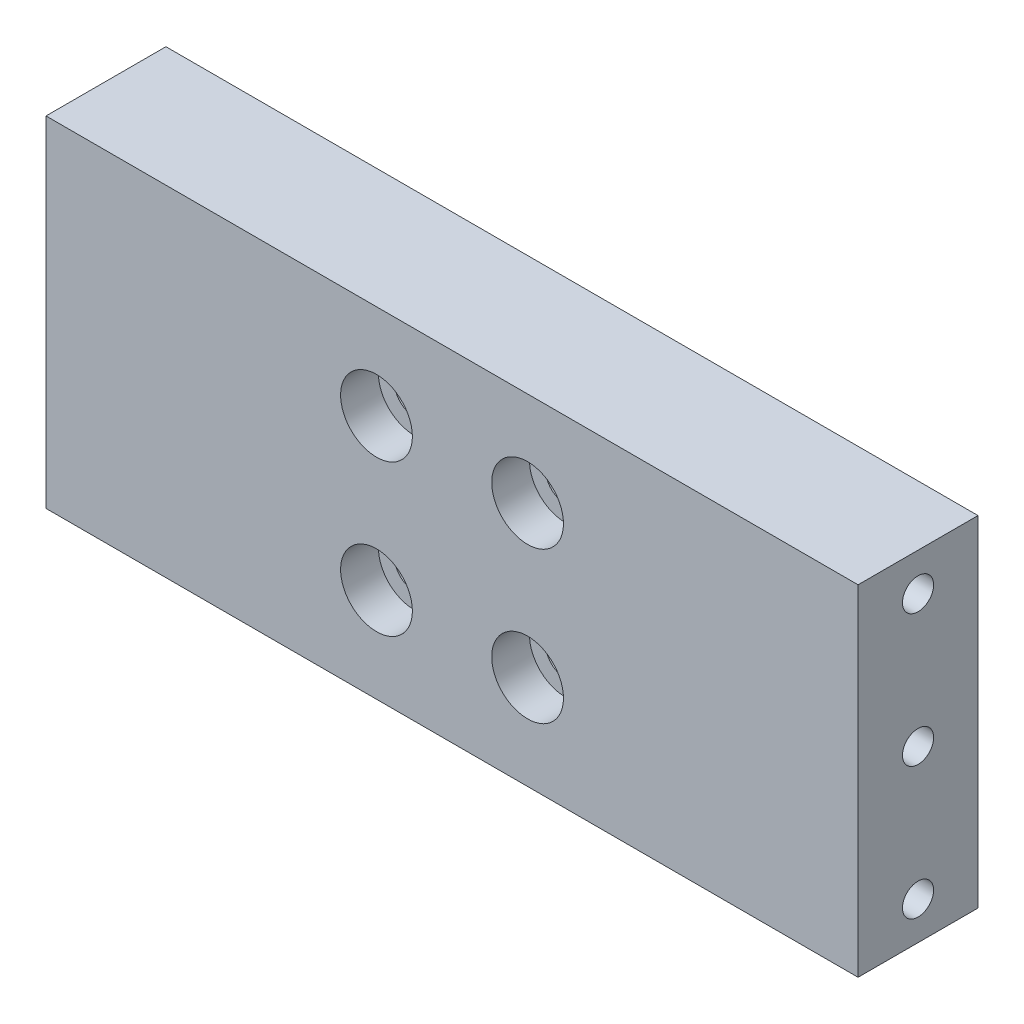
ISO-10303-21;
HEADER;
FILE_DESCRIPTION(('STEP AP214'),'2;1');
FILE_NAME('part.step','',(''),(''),'','','');
FILE_SCHEMA(('AUTOMOTIVE_DESIGN { 1 0 10303 214 1 1 1 1 }'));
ENDSEC;
DATA;
#1=APPLICATION_CONTEXT('core data for automotive mechanical design processes');
#2=APPLICATION_PROTOCOL_DEFINITION('international standard','automotive_design',2000,#1);
#3=PRODUCT_CONTEXT('',#1,'mechanical');
#4=PRODUCT('Part','Part','',(#3));
#5=PRODUCT_RELATED_PRODUCT_CATEGORY('part','',(#4));
#6=PRODUCT_DEFINITION_FORMATION('','',#4);
#7=PRODUCT_DEFINITION_CONTEXT('part definition',#1,'design');
#8=PRODUCT_DEFINITION('design','',#6,#7);
#9=PRODUCT_DEFINITION_SHAPE('','',#8);
#10=(LENGTH_UNIT() NAMED_UNIT(*) SI_UNIT(.MILLI.,.METRE.));
#11=(NAMED_UNIT(*) PLANE_ANGLE_UNIT() SI_UNIT($,.RADIAN.));
#12=(NAMED_UNIT(*) SI_UNIT($,.STERADIAN.) SOLID_ANGLE_UNIT());
#13=UNCERTAINTY_MEASURE_WITH_UNIT(LENGTH_MEASURE(1.E-05),#10,'distance_accuracy_value','');
#14=(GEOMETRIC_REPRESENTATION_CONTEXT(3) GLOBAL_UNCERTAINTY_ASSIGNED_CONTEXT((#13)) GLOBAL_UNIT_ASSIGNED_CONTEXT((#10,
#11,#12)) REPRESENTATION_CONTEXT('',''));
#15=CARTESIAN_POINT('',(0.,0.,0.));
#16=DIRECTION('',(0.,0.,1.));
#17=DIRECTION('',(1.,0.,0.));
#18=AXIS2_PLACEMENT_3D('',#15,#16,#17);
#19=CARTESIAN_POINT('',(-43.,-18.,6.35));
#20=DIRECTION('',(1.,0.,0.));
#21=DIRECTION('',(0.,1.,0.));
#22=AXIS2_PLACEMENT_3D('',#19,#20,#21);
#23=PLANE('',#22);
#24=CARTESIAN_POINT('',(-43.,14.,0.));
#25=DIRECTION('',(-1.,0.,0.));
#26=DIRECTION('',(0.,-1.,0.));
#27=AXIS2_PLACEMENT_3D('',#24,#25,#26);
#28=CIRCLE('',#27,1.65);
#29=CARTESIAN_POINT('',(-43.,12.35,0.));
#30=VERTEX_POINT('',#29);
#31=EDGE_CURVE('E180',#30,#30,#28,.T.);
#32=ORIENTED_EDGE('',*,*,#31,.F.);
#33=EDGE_LOOP('',(#32));
#34=FACE_BOUND('',#33,.T.);
#35=CARTESIAN_POINT('',(-43.,-14.,0.));
#36=DIRECTION('',(-1.,0.,0.));
#37=DIRECTION('',(0.,-1.,0.));
#38=AXIS2_PLACEMENT_3D('',#35,#36,#37);
#39=CIRCLE('',#38,1.65);
#40=CARTESIAN_POINT('',(-43.,-15.65,0.));
#41=VERTEX_POINT('',#40);
#42=EDGE_CURVE('E173',#41,#41,#39,.T.);
#43=ORIENTED_EDGE('',*,*,#42,.F.);
#44=EDGE_LOOP('',(#43));
#45=FACE_BOUND('',#44,.T.);
#46=CARTESIAN_POINT('',(-43.,0.,0.));
#47=DIRECTION('',(-1.,0.,0.));
#48=DIRECTION('',(0.,-1.,0.));
#49=AXIS2_PLACEMENT_3D('',#46,#47,#48);
#50=CIRCLE('',#49,1.65);
#51=CARTESIAN_POINT('',(-43.,-1.64999999999998,0.));
#52=VERTEX_POINT('',#51);
#53=EDGE_CURVE('E170',#52,#52,#50,.T.);
#54=ORIENTED_EDGE('',*,*,#53,.F.);
#55=EDGE_LOOP('',(#54));
#56=FACE_BOUND('',#55,.T.);
#57=DIRECTION('',(0.,-1.,0.));
#58=VECTOR('',#57,1.);
#59=CARTESIAN_POINT('',(-43.,-18.,-6.35));
#60=LINE('',#59,#58);
#61=CARTESIAN_POINT('',(-43.,18.,-6.35));
#62=VERTEX_POINT('',#61);
#63=CARTESIAN_POINT('',(-43.,-18.,-6.35));
#64=VERTEX_POINT('',#63);
#65=EDGE_CURVE('E105',#62,#64,#60,.T.);
#66=ORIENTED_EDGE('',*,*,#65,.T.);
#67=DIRECTION('',(0.,0.,-1.));
#68=VECTOR('',#67,1.);
#69=CARTESIAN_POINT('',(-43.,-18.,6.35));
#70=LINE('',#69,#68);
#71=CARTESIAN_POINT('',(-43.,-18.,6.35));
#72=VERTEX_POINT('',#71);
#73=EDGE_CURVE('E11',#72,#64,#70,.T.);
#74=ORIENTED_EDGE('',*,*,#73,.F.);
#75=DIRECTION('',(0.,-1.,0.));
#76=VECTOR('',#75,1.);
#77=CARTESIAN_POINT('',(-43.,-18.,6.35));
#78=LINE('',#77,#76);
#79=CARTESIAN_POINT('',(-43.,18.,6.35));
#80=VERTEX_POINT('',#79);
#81=EDGE_CURVE('E89',#80,#72,#78,.T.);
#82=ORIENTED_EDGE('',*,*,#81,.F.);
#83=DIRECTION('',(0.,0.,-1.));
#84=VECTOR('',#83,1.);
#85=CARTESIAN_POINT('',(-43.,18.,6.35));
#86=LINE('',#85,#84);
#87=EDGE_CURVE('E98',#80,#62,#86,.T.);
#88=ORIENTED_EDGE('',*,*,#87,.T.);
#89=EDGE_LOOP('',(#66,#74,#82,#88));
#90=FACE_BOUND('',#89,.T.);
#91=ADVANCED_FACE('F39',(#34,#45,#56,#90),#23,.F.);
#92=CARTESIAN_POINT('',(43.,-18.,6.35));
#93=DIRECTION('',(0.,1.,0.));
#94=DIRECTION('',(-1.,0.,0.));
#95=AXIS2_PLACEMENT_3D('',#92,#93,#94);
#96=PLANE('',#95);
#97=DIRECTION('',(1.,0.,0.));
#98=VECTOR('',#97,1.);
#99=CARTESIAN_POINT('',(43.,-18.,-6.35));
#100=LINE('',#99,#98);
#101=CARTESIAN_POINT('',(43.,-18.,-6.35));
#102=VERTEX_POINT('',#101);
#103=EDGE_CURVE('E94',#64,#102,#100,.T.);
#104=ORIENTED_EDGE('',*,*,#103,.T.);
#105=DIRECTION('',(0.,0.,-1.));
#106=VECTOR('',#105,1.);
#107=CARTESIAN_POINT('',(43.,-18.,6.35));
#108=LINE('',#107,#106);
#109=CARTESIAN_POINT('',(43.,-18.,6.35));
#110=VERTEX_POINT('',#109);
#111=EDGE_CURVE('E50',#110,#102,#108,.T.);
#112=ORIENTED_EDGE('',*,*,#111,.F.);
#113=DIRECTION('',(1.,0.,0.));
#114=VECTOR('',#113,1.);
#115=CARTESIAN_POINT('',(43.,-18.,6.35));
#116=LINE('',#115,#114);
#117=EDGE_CURVE('E84',#72,#110,#116,.T.);
#118=ORIENTED_EDGE('',*,*,#117,.F.);
#119=ORIENTED_EDGE('',*,*,#73,.T.);
#120=EDGE_LOOP('',(#104,#112,#118,#119));
#121=FACE_BOUND('',#120,.T.);
#122=ADVANCED_FACE('F91',(#121),#96,.F.);
#123=CARTESIAN_POINT('',(43.,-18.,6.35));
#124=DIRECTION('',(-1.,0.,0.));
#125=DIRECTION('',(0.,0.,1.));
#126=AXIS2_PLACEMENT_3D('',#123,#124,#125);
#127=PLANE('',#126);
#128=CARTESIAN_POINT('',(43.,14.,0.));
#129=DIRECTION('',(-1.,0.,0.));
#130=DIRECTION('',(0.,-1.,0.));
#131=AXIS2_PLACEMENT_3D('',#128,#129,#130);
#132=CIRCLE('',#131,1.65);
#133=CARTESIAN_POINT('',(43.,12.35,0.));
#134=VERTEX_POINT('',#133);
#135=EDGE_CURVE('E192',#134,#134,#132,.T.);
#136=ORIENTED_EDGE('',*,*,#135,.T.);
#137=EDGE_LOOP('',(#136));
#138=FACE_BOUND('',#137,.T.);
#139=CARTESIAN_POINT('',(43.,-14.,0.));
#140=DIRECTION('',(-1.,0.,0.));
#141=DIRECTION('',(0.,-1.,0.));
#142=AXIS2_PLACEMENT_3D('',#139,#140,#141);
#143=CIRCLE('',#142,1.65);
#144=CARTESIAN_POINT('',(43.,-15.65,0.));
#145=VERTEX_POINT('',#144);
#146=EDGE_CURVE('E187',#145,#145,#143,.T.);
#147=ORIENTED_EDGE('',*,*,#146,.T.);
#148=EDGE_LOOP('',(#147));
#149=FACE_BOUND('',#148,.T.);
#150=CARTESIAN_POINT('',(43.,0.,0.));
#151=DIRECTION('',(-1.,0.,0.));
#152=DIRECTION('',(0.,-1.,0.));
#153=AXIS2_PLACEMENT_3D('',#150,#151,#152);
#154=CIRCLE('',#153,1.65);
#155=CARTESIAN_POINT('',(43.,-1.64999999999998,0.));
#156=VERTEX_POINT('',#155);
#157=EDGE_CURVE('E185',#156,#156,#154,.T.);
#158=ORIENTED_EDGE('',*,*,#157,.T.);
#159=EDGE_LOOP('',(#158));
#160=FACE_BOUND('',#159,.T.);
#161=DIRECTION('',(0.,1.,0.));
#162=VECTOR('',#161,1.);
#163=CARTESIAN_POINT('',(43.,-18.,-6.35));
#164=LINE('',#163,#162);
#165=CARTESIAN_POINT('',(43.,18.,-6.35));
#166=VERTEX_POINT('',#165);
#167=EDGE_CURVE('E75',#102,#166,#164,.T.);
#168=ORIENTED_EDGE('',*,*,#167,.T.);
#169=DIRECTION('',(0.,0.,-1.));
#170=VECTOR('',#169,1.);
#171=CARTESIAN_POINT('',(43.,18.,6.35));
#172=LINE('',#171,#170);
#173=CARTESIAN_POINT('',(43.,18.,6.35));
#174=VERTEX_POINT('',#173);
#175=EDGE_CURVE('E92',#174,#166,#172,.T.);
#176=ORIENTED_EDGE('',*,*,#175,.F.);
#177=DIRECTION('',(0.,1.,0.));
#178=VECTOR('',#177,1.);
#179=CARTESIAN_POINT('',(43.,-18.,6.35));
#180=LINE('',#179,#178);
#181=EDGE_CURVE('E86',#110,#174,#180,.T.);
#182=ORIENTED_EDGE('',*,*,#181,.F.);
#183=ORIENTED_EDGE('',*,*,#111,.T.);
#184=EDGE_LOOP('',(#168,#176,#182,#183));
#185=FACE_BOUND('',#184,.T.);
#186=ADVANCED_FACE('F96',(#138,#149,#160,#185),#127,.F.);
#187=CARTESIAN_POINT('',(43.,18.,6.35));
#188=DIRECTION('',(0.,-1.,0.));
#189=DIRECTION('',(0.,0.,-1.));
#190=AXIS2_PLACEMENT_3D('',#187,#188,#189);
#191=PLANE('',#190);
#192=DIRECTION('',(-1.,0.,0.));
#193=VECTOR('',#192,1.);
#194=CARTESIAN_POINT('',(43.,18.,-6.35));
#195=LINE('',#194,#193);
#196=EDGE_CURVE('E77',#166,#62,#195,.T.);
#197=ORIENTED_EDGE('',*,*,#196,.T.);
#198=ORIENTED_EDGE('',*,*,#87,.F.);
#199=DIRECTION('',(-1.,0.,0.));
#200=VECTOR('',#199,1.);
#201=CARTESIAN_POINT('',(43.,18.,6.35));
#202=LINE('',#201,#200);
#203=EDGE_CURVE('E54',#174,#80,#202,.T.);
#204=ORIENTED_EDGE('',*,*,#203,.F.);
#205=ORIENTED_EDGE('',*,*,#175,.T.);
#206=EDGE_LOOP('',(#197,#198,#204,#205));
#207=FACE_BOUND('',#206,.T.);
#208=ADVANCED_FACE('F109',(#207),#191,.F.);
#209=CARTESIAN_POINT('',(0.,0.,6.35));
#210=DIRECTION('',(0.,0.,1.));
#211=DIRECTION('',(1.,0.,0.));
#212=AXIS2_PLACEMENT_3D('',#209,#210,#211);
#213=PLANE('',#212);
#214=CARTESIAN_POINT('',(-8.,8.,6.35));
#215=DIRECTION('',(0.,0.,1.));
#216=DIRECTION('',(1.,0.,0.));
#217=AXIS2_PLACEMENT_3D('',#214,#215,#216);
#218=CIRCLE('',#217,3.79999999999999);
#219=CARTESIAN_POINT('',(-4.20000000000001,8.,6.35));
#220=VERTEX_POINT('',#219);
#221=EDGE_CURVE('E159',#220,#220,#218,.T.);
#222=ORIENTED_EDGE('',*,*,#221,.F.);
#223=EDGE_LOOP('',(#222));
#224=FACE_BOUND('',#223,.T.);
#225=CARTESIAN_POINT('',(-8.00000000000008,-7.99999999999992,6.35));
#226=DIRECTION('',(0.,0.,1.));
#227=DIRECTION('',(1.,0.,0.));
#228=AXIS2_PLACEMENT_3D('',#225,#226,#227);
#229=CIRCLE('',#228,3.79999999999999);
#230=CARTESIAN_POINT('',(-4.20000000000009,-7.99999999999992,6.35));
#231=VERTEX_POINT('',#230);
#232=EDGE_CURVE('E146',#231,#231,#229,.T.);
#233=ORIENTED_EDGE('',*,*,#232,.F.);
#234=EDGE_LOOP('',(#233));
#235=FACE_BOUND('',#234,.T.);
#236=CARTESIAN_POINT('',(8.,-8.,6.35));
#237=DIRECTION('',(0.,0.,1.));
#238=DIRECTION('',(1.,0.,0.));
#239=AXIS2_PLACEMENT_3D('',#236,#237,#238);
#240=CIRCLE('',#239,3.79999999999999);
#241=CARTESIAN_POINT('',(11.8,-8.,6.35));
#242=VERTEX_POINT('',#241);
#243=EDGE_CURVE('E136',#242,#242,#240,.T.);
#244=ORIENTED_EDGE('',*,*,#243,.F.);
#245=EDGE_LOOP('',(#244));
#246=FACE_BOUND('',#245,.T.);
#247=CARTESIAN_POINT('',(8.,8.,6.35));
#248=DIRECTION('',(0.,0.,1.));
#249=DIRECTION('',(1.,0.,0.));
#250=AXIS2_PLACEMENT_3D('',#247,#248,#249);
#251=CIRCLE('',#250,3.79999999999999);
#252=CARTESIAN_POINT('',(11.8,8.,6.35));
#253=VERTEX_POINT('',#252);
#254=EDGE_CURVE('E122',#253,#253,#251,.T.);
#255=ORIENTED_EDGE('',*,*,#254,.F.);
#256=EDGE_LOOP('',(#255));
#257=FACE_BOUND('',#256,.T.);
#258=ORIENTED_EDGE('',*,*,#81,.T.);
#259=ORIENTED_EDGE('',*,*,#117,.T.);
#260=ORIENTED_EDGE('',*,*,#181,.T.);
#261=ORIENTED_EDGE('',*,*,#203,.T.);
#262=EDGE_LOOP('',(#258,#259,#260,#261));
#263=FACE_BOUND('',#262,.T.);
#264=ADVANCED_FACE('F88',(#224,#235,#246,#257,#263),#213,.T.);
#265=CARTESIAN_POINT('',(0.,0.,-6.35));
#266=DIRECTION('',(0.,0.,1.));
#267=DIRECTION('',(1.,0.,0.));
#268=AXIS2_PLACEMENT_3D('',#265,#266,#267);
#269=PLANE('',#268);
#270=CARTESIAN_POINT('',(-8.,8.,-6.35));
#271=DIRECTION('',(0.,0.,1.));
#272=DIRECTION('',(1.,0.,0.));
#273=AXIS2_PLACEMENT_3D('',#270,#271,#272);
#274=CIRCLE('',#273,2.1);
#275=CARTESIAN_POINT('',(-5.9,8.,-6.35));
#276=VERTEX_POINT('',#275);
#277=EDGE_CURVE('E151',#276,#276,#274,.T.);
#278=ORIENTED_EDGE('',*,*,#277,.T.);
#279=EDGE_LOOP('',(#278));
#280=FACE_BOUND('',#279,.T.);
#281=CARTESIAN_POINT('',(-8.00000000000008,-7.99999999999992,-6.35));
#282=DIRECTION('',(0.,0.,1.));
#283=DIRECTION('',(1.,0.,0.));
#284=AXIS2_PLACEMENT_3D('',#281,#282,#283);
#285=CIRCLE('',#284,2.1);
#286=CARTESIAN_POINT('',(-5.90000000000009,-7.99999999999992,-6.35));
#287=VERTEX_POINT('',#286);
#288=EDGE_CURVE('E137',#287,#287,#285,.T.);
#289=ORIENTED_EDGE('',*,*,#288,.T.);
#290=EDGE_LOOP('',(#289));
#291=FACE_BOUND('',#290,.T.);
#292=CARTESIAN_POINT('',(8.,-8.,-6.35));
#293=DIRECTION('',(0.,0.,1.));
#294=DIRECTION('',(1.,0.,0.));
#295=AXIS2_PLACEMENT_3D('',#292,#293,#294);
#296=CIRCLE('',#295,2.1);
#297=CARTESIAN_POINT('',(10.1,-8.,-6.35));
#298=VERTEX_POINT('',#297);
#299=EDGE_CURVE('E130',#298,#298,#296,.T.);
#300=ORIENTED_EDGE('',*,*,#299,.T.);
#301=EDGE_LOOP('',(#300));
#302=FACE_BOUND('',#301,.T.);
#303=CARTESIAN_POINT('',(8.,8.,-6.35));
#304=DIRECTION('',(0.,0.,1.));
#305=DIRECTION('',(1.,0.,0.));
#306=AXIS2_PLACEMENT_3D('',#303,#304,#305);
#307=CIRCLE('',#306,2.1);
#308=CARTESIAN_POINT('',(10.1,8.,-6.35));
#309=VERTEX_POINT('',#308);
#310=EDGE_CURVE('E104',#309,#309,#307,.T.);
#311=ORIENTED_EDGE('',*,*,#310,.T.);
#312=EDGE_LOOP('',(#311));
#313=FACE_BOUND('',#312,.T.);
#314=ORIENTED_EDGE('',*,*,#65,.F.);
#315=ORIENTED_EDGE('',*,*,#196,.F.);
#316=ORIENTED_EDGE('',*,*,#167,.F.);
#317=ORIENTED_EDGE('',*,*,#103,.F.);
#318=EDGE_LOOP('',(#314,#315,#316,#317));
#319=FACE_BOUND('',#318,.T.);
#320=ADVANCED_FACE('F114',(#280,#291,#302,#313,#319),#269,.F.);
#321=CARTESIAN_POINT('',(8.,8.,6.35));
#322=DIRECTION('',(0.,0.,1.));
#323=DIRECTION('',(1.,0.,0.));
#324=AXIS2_PLACEMENT_3D('',#321,#322,#323);
#325=CYLINDRICAL_SURFACE('',#324,2.1);
#326=ORIENTED_EDGE('',*,*,#310,.F.);
#327=EDGE_LOOP('',(#326));
#328=FACE_BOUND('',#327,.T.);
#329=CARTESIAN_POINT('',(8.,8.,2.35));
#330=DIRECTION('',(0.,0.,1.));
#331=DIRECTION('',(1.,0.,0.));
#332=AXIS2_PLACEMENT_3D('',#329,#330,#331);
#333=CIRCLE('',#332,2.1);
#334=CARTESIAN_POINT('',(10.1,8.,2.35));
#335=VERTEX_POINT('',#334);
#336=EDGE_CURVE('E117',#335,#335,#333,.T.);
#337=ORIENTED_EDGE('',*,*,#336,.T.);
#338=EDGE_LOOP('',(#337));
#339=FACE_BOUND('',#338,.T.);
#340=ADVANCED_FACE('F281',(#328,#339),#325,.F.);
#341=CARTESIAN_POINT('',(10.1,8.,2.35));
#342=DIRECTION('',(0.,0.,-1.));
#343=DIRECTION('',(-1.,0.,0.));
#344=AXIS2_PLACEMENT_3D('',#341,#342,#343);
#345=PLANE('',#344);
#346=ORIENTED_EDGE('',*,*,#336,.F.);
#347=EDGE_LOOP('',(#346));
#348=FACE_BOUND('',#347,.T.);
#349=CARTESIAN_POINT('',(8.,8.,2.35));
#350=DIRECTION('',(0.,0.,1.));
#351=DIRECTION('',(1.,0.,0.));
#352=AXIS2_PLACEMENT_3D('',#349,#350,#351);
#353=CIRCLE('',#352,3.8);
#354=CARTESIAN_POINT('',(11.8,8.,2.35));
#355=VERTEX_POINT('',#354);
#356=EDGE_CURVE('E121',#355,#355,#353,.T.);
#357=ORIENTED_EDGE('',*,*,#356,.T.);
#358=EDGE_LOOP('',(#357));
#359=FACE_BOUND('',#358,.T.);
#360=ADVANCED_FACE('F280',(#348,#359),#345,.F.);
#361=CARTESIAN_POINT('',(8.,8.,6.35));
#362=DIRECTION('',(0.,0.,1.));
#363=DIRECTION('',(1.,0.,0.));
#364=AXIS2_PLACEMENT_3D('',#361,#362,#363);
#365=CYLINDRICAL_SURFACE('',#364,3.8);
#366=ORIENTED_EDGE('',*,*,#356,.F.);
#367=EDGE_LOOP('',(#366));
#368=FACE_BOUND('',#367,.T.);
#369=ORIENTED_EDGE('',*,*,#254,.T.);
#370=EDGE_LOOP('',(#369));
#371=FACE_BOUND('',#370,.T.);
#372=ADVANCED_FACE('F272',(#368,#371),#365,.F.);
#373=CARTESIAN_POINT('',(8.,-8.,6.35));
#374=DIRECTION('',(0.,0.,1.));
#375=DIRECTION('',(1.,0.,0.));
#376=AXIS2_PLACEMENT_3D('',#373,#374,#375);
#377=CYLINDRICAL_SURFACE('',#376,2.1);
#378=ORIENTED_EDGE('',*,*,#299,.F.);
#379=EDGE_LOOP('',(#378));
#380=FACE_BOUND('',#379,.T.);
#381=CARTESIAN_POINT('',(8.,-8.,2.35));
#382=DIRECTION('',(0.,0.,1.));
#383=DIRECTION('',(1.,0.,0.));
#384=AXIS2_PLACEMENT_3D('',#381,#382,#383);
#385=CIRCLE('',#384,2.1);
#386=CARTESIAN_POINT('',(10.1,-8.,2.35));
#387=VERTEX_POINT('',#386);
#388=EDGE_CURVE('E128',#387,#387,#385,.T.);
#389=ORIENTED_EDGE('',*,*,#388,.T.);
#390=EDGE_LOOP('',(#389));
#391=FACE_BOUND('',#390,.T.);
#392=ADVANCED_FACE('F267',(#380,#391),#377,.F.);
#393=CARTESIAN_POINT('',(10.1,-8.,2.35));
#394=DIRECTION('',(0.,0.,-1.));
#395=DIRECTION('',(-1.,0.,0.));
#396=AXIS2_PLACEMENT_3D('',#393,#394,#395);
#397=PLANE('',#396);
#398=ORIENTED_EDGE('',*,*,#388,.F.);
#399=EDGE_LOOP('',(#398));
#400=FACE_BOUND('',#399,.T.);
#401=CARTESIAN_POINT('',(8.,-8.,2.35));
#402=DIRECTION('',(0.,0.,1.));
#403=DIRECTION('',(1.,0.,0.));
#404=AXIS2_PLACEMENT_3D('',#401,#402,#403);
#405=CIRCLE('',#404,3.8);
#406=CARTESIAN_POINT('',(11.8,-8.,2.35));
#407=VERTEX_POINT('',#406);
#408=EDGE_CURVE('E132',#407,#407,#405,.T.);
#409=ORIENTED_EDGE('',*,*,#408,.T.);
#410=EDGE_LOOP('',(#409));
#411=FACE_BOUND('',#410,.T.);
#412=ADVANCED_FACE('F264',(#400,#411),#397,.F.);
#413=CARTESIAN_POINT('',(8.,-8.,6.35));
#414=DIRECTION('',(0.,0.,1.));
#415=DIRECTION('',(1.,0.,0.));
#416=AXIS2_PLACEMENT_3D('',#413,#414,#415);
#417=CYLINDRICAL_SURFACE('',#416,3.8);
#418=ORIENTED_EDGE('',*,*,#408,.F.);
#419=EDGE_LOOP('',(#418));
#420=FACE_BOUND('',#419,.T.);
#421=ORIENTED_EDGE('',*,*,#243,.T.);
#422=EDGE_LOOP('',(#421));
#423=FACE_BOUND('',#422,.T.);
#424=ADVANCED_FACE('F261',(#420,#423),#417,.F.);
#425=CARTESIAN_POINT('',(-8.00000000000008,-7.99999999999992,6.35));
#426=DIRECTION('',(0.,0.,1.));
#427=DIRECTION('',(1.,0.,0.));
#428=AXIS2_PLACEMENT_3D('',#425,#426,#427);
#429=CYLINDRICAL_SURFACE('',#428,2.1);
#430=ORIENTED_EDGE('',*,*,#288,.F.);
#431=EDGE_LOOP('',(#430));
#432=FACE_BOUND('',#431,.T.);
#433=CARTESIAN_POINT('',(-8.00000000000008,-7.99999999999992,2.35));
#434=DIRECTION('',(0.,0.,1.));
#435=DIRECTION('',(1.,0.,0.));
#436=AXIS2_PLACEMENT_3D('',#433,#434,#435);
#437=CIRCLE('',#436,2.1);
#438=CARTESIAN_POINT('',(-5.90000000000008,-7.99999999999992,2.35));
#439=VERTEX_POINT('',#438);
#440=EDGE_CURVE('E142',#439,#439,#437,.T.);
#441=ORIENTED_EDGE('',*,*,#440,.T.);
#442=EDGE_LOOP('',(#441));
#443=FACE_BOUND('',#442,.T.);
#444=ADVANCED_FACE('F260',(#432,#443),#429,.F.);
#445=CARTESIAN_POINT('',(-5.90000000000008,-7.99999999999992,2.35));
#446=DIRECTION('',(0.,0.,-1.));
#447=DIRECTION('',(-1.,0.,0.));
#448=AXIS2_PLACEMENT_3D('',#445,#446,#447);
#449=PLANE('',#448);
#450=ORIENTED_EDGE('',*,*,#440,.F.);
#451=EDGE_LOOP('',(#450));
#452=FACE_BOUND('',#451,.T.);
#453=CARTESIAN_POINT('',(-8.00000000000008,-7.99999999999992,2.35));
#454=DIRECTION('',(0.,0.,1.));
#455=DIRECTION('',(1.,0.,0.));
#456=AXIS2_PLACEMENT_3D('',#453,#454,#455);
#457=CIRCLE('',#456,3.8);
#458=CARTESIAN_POINT('',(-4.20000000000009,-7.99999999999992,2.35));
#459=VERTEX_POINT('',#458);
#460=EDGE_CURVE('E144',#459,#459,#457,.T.);
#461=ORIENTED_EDGE('',*,*,#460,.T.);
#462=EDGE_LOOP('',(#461));
#463=FACE_BOUND('',#462,.T.);
#464=ADVANCED_FACE('F251',(#452,#463),#449,.F.);
#465=CARTESIAN_POINT('',(-8.00000000000008,-7.99999999999992,6.35));
#466=DIRECTION('',(0.,0.,1.));
#467=DIRECTION('',(1.,0.,0.));
#468=AXIS2_PLACEMENT_3D('',#465,#466,#467);
#469=CYLINDRICAL_SURFACE('',#468,3.8);
#470=ORIENTED_EDGE('',*,*,#460,.F.);
#471=EDGE_LOOP('',(#470));
#472=FACE_BOUND('',#471,.T.);
#473=ORIENTED_EDGE('',*,*,#232,.T.);
#474=EDGE_LOOP('',(#473));
#475=FACE_BOUND('',#474,.T.);
#476=ADVANCED_FACE('F247',(#472,#475),#469,.F.);
#477=CARTESIAN_POINT('',(-8.,8.,6.35));
#478=DIRECTION('',(0.,0.,1.));
#479=DIRECTION('',(1.,0.,0.));
#480=AXIS2_PLACEMENT_3D('',#477,#478,#479);
#481=CYLINDRICAL_SURFACE('',#480,2.1);
#482=ORIENTED_EDGE('',*,*,#277,.F.);
#483=EDGE_LOOP('',(#482));
#484=FACE_BOUND('',#483,.T.);
#485=CARTESIAN_POINT('',(-8.,8.,2.35));
#486=DIRECTION('',(0.,0.,1.));
#487=DIRECTION('',(1.,0.,0.));
#488=AXIS2_PLACEMENT_3D('',#485,#486,#487);
#489=CIRCLE('',#488,2.1);
#490=CARTESIAN_POINT('',(-5.9,8.,2.35));
#491=VERTEX_POINT('',#490);
#492=EDGE_CURVE('E152',#491,#491,#489,.T.);
#493=ORIENTED_EDGE('',*,*,#492,.T.);
#494=EDGE_LOOP('',(#493));
#495=FACE_BOUND('',#494,.T.);
#496=ADVANCED_FACE('F244',(#484,#495),#481,.F.);
#497=CARTESIAN_POINT('',(-5.9,8.,2.35));
#498=DIRECTION('',(0.,0.,-1.));
#499=DIRECTION('',(-1.,0.,0.));
#500=AXIS2_PLACEMENT_3D('',#497,#498,#499);
#501=PLANE('',#500);
#502=ORIENTED_EDGE('',*,*,#492,.F.);
#503=EDGE_LOOP('',(#502));
#504=FACE_BOUND('',#503,.T.);
#505=CARTESIAN_POINT('',(-8.,8.,2.35));
#506=DIRECTION('',(0.,0.,1.));
#507=DIRECTION('',(1.,0.,0.));
#508=AXIS2_PLACEMENT_3D('',#505,#506,#507);
#509=CIRCLE('',#508,3.8);
#510=CARTESIAN_POINT('',(-4.2,8.,2.35));
#511=VERTEX_POINT('',#510);
#512=EDGE_CURVE('E160',#511,#511,#509,.T.);
#513=ORIENTED_EDGE('',*,*,#512,.T.);
#514=EDGE_LOOP('',(#513));
#515=FACE_BOUND('',#514,.T.);
#516=ADVANCED_FACE('F234',(#504,#515),#501,.F.);
#517=CARTESIAN_POINT('',(-8.,8.,6.35));
#518=DIRECTION('',(0.,0.,1.));
#519=DIRECTION('',(1.,0.,0.));
#520=AXIS2_PLACEMENT_3D('',#517,#518,#519);
#521=CYLINDRICAL_SURFACE('',#520,3.8);
#522=ORIENTED_EDGE('',*,*,#512,.F.);
#523=EDGE_LOOP('',(#522));
#524=FACE_BOUND('',#523,.T.);
#525=ORIENTED_EDGE('',*,*,#221,.T.);
#526=EDGE_LOOP('',(#525));
#527=FACE_BOUND('',#526,.T.);
#528=ADVANCED_FACE('F226',(#524,#527),#521,.F.);
#529=CARTESIAN_POINT('',(-33.,0.,0.));
#530=DIRECTION('',(-1.,0.,0.));
#531=DIRECTION('',(0.,-1.,0.));
#532=AXIS2_PLACEMENT_3D('',#529,#530,#531);
#533=CYLINDRICAL_SURFACE('',#532,1.65);
#534=CARTESIAN_POINT('',(-33.,0.,0.));
#535=DIRECTION('',(-1.,0.,0.));
#536=DIRECTION('',(0.,-1.,0.));
#537=AXIS2_PLACEMENT_3D('',#534,#535,#536);
#538=CIRCLE('',#537,1.65);
#539=CARTESIAN_POINT('',(-33.,-1.64999999999998,0.));
#540=VERTEX_POINT('',#539);
#541=EDGE_CURVE('E163',#540,#540,#538,.T.);
#542=ORIENTED_EDGE('',*,*,#541,.F.);
#543=EDGE_LOOP('',(#542));
#544=FACE_BOUND('',#543,.T.);
#545=ORIENTED_EDGE('',*,*,#53,.T.);
#546=EDGE_LOOP('',(#545));
#547=FACE_BOUND('',#546,.T.);
#548=ADVANCED_FACE('F221',(#544,#547),#533,.F.);
#549=CARTESIAN_POINT('',(-33.,0.,0.));
#550=DIRECTION('',(-1.,0.,0.));
#551=DIRECTION('',(0.,-1.,0.));
#552=AXIS2_PLACEMENT_3D('',#549,#550,#551);
#553=PLANE('',#552);
#554=ORIENTED_EDGE('',*,*,#541,.T.);
#555=EDGE_LOOP('',(#554));
#556=FACE_BOUND('',#555,.T.);
#557=ADVANCED_FACE('F223',(#556),#553,.T.);
#558=CARTESIAN_POINT('',(-33.,-14.,0.));
#559=DIRECTION('',(-1.,0.,0.));
#560=DIRECTION('',(0.,-1.,0.));
#561=AXIS2_PLACEMENT_3D('',#558,#559,#560);
#562=CYLINDRICAL_SURFACE('',#561,1.65);
#563=CARTESIAN_POINT('',(-33.,-14.,0.));
#564=DIRECTION('',(-1.,0.,0.));
#565=DIRECTION('',(0.,-1.,0.));
#566=AXIS2_PLACEMENT_3D('',#563,#564,#565);
#567=CIRCLE('',#566,1.65);
#568=CARTESIAN_POINT('',(-33.,-15.65,0.));
#569=VERTEX_POINT('',#568);
#570=EDGE_CURVE('E171',#569,#569,#567,.T.);
#571=ORIENTED_EDGE('',*,*,#570,.F.);
#572=EDGE_LOOP('',(#571));
#573=FACE_BOUND('',#572,.T.);
#574=ORIENTED_EDGE('',*,*,#42,.T.);
#575=EDGE_LOOP('',(#574));
#576=FACE_BOUND('',#575,.T.);
#577=ADVANCED_FACE('F235',(#573,#576),#562,.F.);
#578=CARTESIAN_POINT('',(-33.,-14.,0.));
#579=DIRECTION('',(-1.,0.,0.));
#580=DIRECTION('',(0.,-1.,0.));
#581=AXIS2_PLACEMENT_3D('',#578,#579,#580);
#582=PLANE('',#581);
#583=ORIENTED_EDGE('',*,*,#570,.T.);
#584=EDGE_LOOP('',(#583));
#585=FACE_BOUND('',#584,.T.);
#586=ADVANCED_FACE('F238',(#585),#582,.T.);
#587=CARTESIAN_POINT('',(-33.,14.,0.));
#588=DIRECTION('',(-1.,0.,0.));
#589=DIRECTION('',(0.,-1.,0.));
#590=AXIS2_PLACEMENT_3D('',#587,#588,#589);
#591=CYLINDRICAL_SURFACE('',#590,1.65);
#592=CARTESIAN_POINT('',(-33.,14.,0.));
#593=DIRECTION('',(-1.,0.,0.));
#594=DIRECTION('',(0.,-1.,0.));
#595=AXIS2_PLACEMENT_3D('',#592,#593,#594);
#596=CIRCLE('',#595,1.65);
#597=CARTESIAN_POINT('',(-33.,12.35,0.));
#598=VERTEX_POINT('',#597);
#599=EDGE_CURVE('E162',#598,#598,#596,.T.);
#600=ORIENTED_EDGE('',*,*,#599,.F.);
#601=EDGE_LOOP('',(#600));
#602=FACE_BOUND('',#601,.T.);
#603=ORIENTED_EDGE('',*,*,#31,.T.);
#604=EDGE_LOOP('',(#603));
#605=FACE_BOUND('',#604,.T.);
#606=ADVANCED_FACE('F320',(#602,#605),#591,.F.);
#607=CARTESIAN_POINT('',(-33.,14.,0.));
#608=DIRECTION('',(-1.,0.,0.));
#609=DIRECTION('',(0.,-1.,0.));
#610=AXIS2_PLACEMENT_3D('',#607,#608,#609);
#611=PLANE('',#610);
#612=ORIENTED_EDGE('',*,*,#599,.T.);
#613=EDGE_LOOP('',(#612));
#614=FACE_BOUND('',#613,.T.);
#615=ADVANCED_FACE('F306',(#614),#611,.T.);
#616=CARTESIAN_POINT('',(33.,0.,0.));
#617=DIRECTION('',(1.,0.,0.));
#618=DIRECTION('',(0.,1.,0.));
#619=AXIS2_PLACEMENT_3D('',#616,#617,#618);
#620=CYLINDRICAL_SURFACE('',#619,1.65);
#621=CARTESIAN_POINT('',(33.,0.,0.));
#622=DIRECTION('',(-1.,0.,0.));
#623=DIRECTION('',(0.,-1.,0.));
#624=AXIS2_PLACEMENT_3D('',#621,#622,#623);
#625=CIRCLE('',#624,1.65);
#626=CARTESIAN_POINT('',(33.,-1.64999999999998,0.));
#627=VERTEX_POINT('',#626);
#628=EDGE_CURVE('E183',#627,#627,#625,.T.);
#629=ORIENTED_EDGE('',*,*,#628,.T.);
#630=EDGE_LOOP('',(#629));
#631=FACE_BOUND('',#630,.T.);
#632=ORIENTED_EDGE('',*,*,#157,.F.);
#633=EDGE_LOOP('',(#632));
#634=FACE_BOUND('',#633,.T.);
#635=ADVANCED_FACE('F308',(#631,#634),#620,.F.);
#636=CARTESIAN_POINT('',(33.,0.,0.));
#637=DIRECTION('',(1.,0.,0.));
#638=DIRECTION('',(0.,-1.,0.));
#639=AXIS2_PLACEMENT_3D('',#636,#637,#638);
#640=PLANE('',#639);
#641=ORIENTED_EDGE('',*,*,#628,.F.);
#642=EDGE_LOOP('',(#641));
#643=FACE_BOUND('',#642,.T.);
#644=ADVANCED_FACE('F307',(#643),#640,.T.);
#645=CARTESIAN_POINT('',(33.,-14.,0.));
#646=DIRECTION('',(1.,0.,0.));
#647=DIRECTION('',(0.,1.,0.));
#648=AXIS2_PLACEMENT_3D('',#645,#646,#647);
#649=CYLINDRICAL_SURFACE('',#648,1.65);
#650=CARTESIAN_POINT('',(33.,-14.,0.));
#651=DIRECTION('',(-1.,0.,0.));
#652=DIRECTION('',(0.,-1.,0.));
#653=AXIS2_PLACEMENT_3D('',#650,#651,#652);
#654=CIRCLE('',#653,1.65);
#655=CARTESIAN_POINT('',(33.,-15.65,0.));
#656=VERTEX_POINT('',#655);
#657=EDGE_CURVE('E191',#656,#656,#654,.T.);
#658=ORIENTED_EDGE('',*,*,#657,.T.);
#659=EDGE_LOOP('',(#658));
#660=FACE_BOUND('',#659,.T.);
#661=ORIENTED_EDGE('',*,*,#146,.F.);
#662=EDGE_LOOP('',(#661));
#663=FACE_BOUND('',#662,.T.);
#664=ADVANCED_FACE('F314',(#660,#663),#649,.F.);
#665=CARTESIAN_POINT('',(33.,-14.,0.));
#666=DIRECTION('',(1.,0.,0.));
#667=DIRECTION('',(0.,-1.,0.));
#668=AXIS2_PLACEMENT_3D('',#665,#666,#667);
#669=PLANE('',#668);
#670=ORIENTED_EDGE('',*,*,#657,.F.);
#671=EDGE_LOOP('',(#670));
#672=FACE_BOUND('',#671,.T.);
#673=ADVANCED_FACE('F207',(#672),#669,.T.);
#674=CARTESIAN_POINT('',(33.,14.,0.));
#675=DIRECTION('',(1.,0.,0.));
#676=DIRECTION('',(0.,1.,0.));
#677=AXIS2_PLACEMENT_3D('',#674,#675,#676);
#678=CYLINDRICAL_SURFACE('',#677,1.65);
#679=CARTESIAN_POINT('',(33.,14.,0.));
#680=DIRECTION('',(-1.,0.,0.));
#681=DIRECTION('',(0.,-1.,0.));
#682=AXIS2_PLACEMENT_3D('',#679,#680,#681);
#683=CIRCLE('',#682,1.65);
#684=CARTESIAN_POINT('',(33.,12.35,0.));
#685=VERTEX_POINT('',#684);
#686=EDGE_CURVE('E169',#685,#685,#683,.T.);
#687=ORIENTED_EDGE('',*,*,#686,.T.);
#688=EDGE_LOOP('',(#687));
#689=FACE_BOUND('',#688,.T.);
#690=ORIENTED_EDGE('',*,*,#135,.F.);
#691=EDGE_LOOP('',(#690));
#692=FACE_BOUND('',#691,.T.);
#693=ADVANCED_FACE('F199',(#689,#692),#678,.F.);
#694=CARTESIAN_POINT('',(33.,14.,0.));
#695=DIRECTION('',(1.,0.,0.));
#696=DIRECTION('',(0.,-1.,0.));
#697=AXIS2_PLACEMENT_3D('',#694,#695,#696);
#698=PLANE('',#697);
#699=ORIENTED_EDGE('',*,*,#686,.F.);
#700=EDGE_LOOP('',(#699));
#701=FACE_BOUND('',#700,.T.);
#702=ADVANCED_FACE('F201',(#701),#698,.T.);
#703=CLOSED_SHELL('',(#91,#122,#186,#208,#264,#320,#340,#360,#372,#392,#412,#424,#444,#464,#476,
#496,#516,#528,#548,#557,#577,#586,#606,#615,#635,#644,#664,#673,#693,#702));
#704=MANIFOLD_SOLID_BREP('B2',#703);
#705=ADVANCED_BREP_SHAPE_REPRESENTATION('',(#18,#704),#14);
#706=SHAPE_DEFINITION_REPRESENTATION(#9,#705);
ENDSEC;
END-ISO-10303-21;
